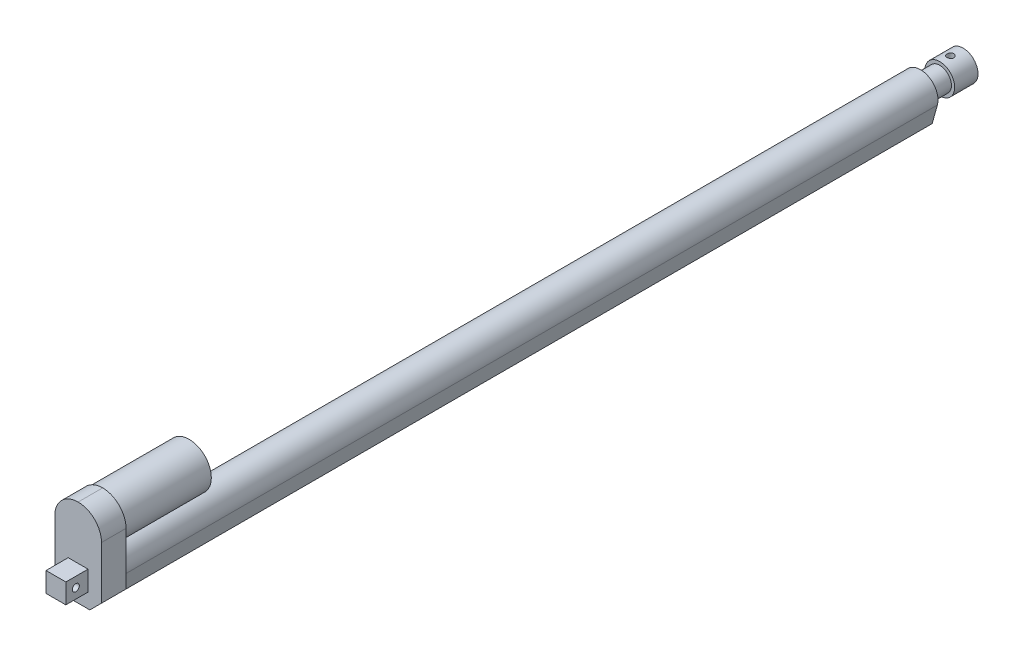
ISO-10303-21;
HEADER;
FILE_DESCRIPTION(('STEP AP214'),'2;1');
FILE_NAME('part.step','',(''),(''),'','','');
FILE_SCHEMA(('AUTOMOTIVE_DESIGN { 1 0 10303 214 1 1 1 1 }'));
ENDSEC;
DATA;
#1=APPLICATION_CONTEXT('core data for automotive mechanical design processes');
#2=APPLICATION_PROTOCOL_DEFINITION('international standard','automotive_design',2000,#1);
#3=PRODUCT_CONTEXT('',#1,'mechanical');
#4=PRODUCT('Part','Part','',(#3));
#5=PRODUCT_RELATED_PRODUCT_CATEGORY('part','',(#4));
#6=PRODUCT_DEFINITION_FORMATION('','',#4);
#7=PRODUCT_DEFINITION_CONTEXT('part definition',#1,'design');
#8=PRODUCT_DEFINITION('design','',#6,#7);
#9=PRODUCT_DEFINITION_SHAPE('','',#8);
#10=(LENGTH_UNIT() NAMED_UNIT(*) SI_UNIT(.MILLI.,.METRE.));
#11=(NAMED_UNIT(*) PLANE_ANGLE_UNIT() SI_UNIT($,.RADIAN.));
#12=(NAMED_UNIT(*) SI_UNIT($,.STERADIAN.) SOLID_ANGLE_UNIT());
#13=UNCERTAINTY_MEASURE_WITH_UNIT(LENGTH_MEASURE(1.E-05),#10,'distance_accuracy_value','');
#14=(GEOMETRIC_REPRESENTATION_CONTEXT(3) GLOBAL_UNCERTAINTY_ASSIGNED_CONTEXT((#13)) GLOBAL_UNIT_ASSIGNED_CONTEXT((#10,
#11,#12)) REPRESENTATION_CONTEXT('',''));
#15=CARTESIAN_POINT('',(0.,0.,0.));
#16=DIRECTION('',(0.,0.,1.));
#17=DIRECTION('',(1.,0.,0.));
#18=AXIS2_PLACEMENT_3D('',#15,#16,#17);
#19=CARTESIAN_POINT('',(0.,0.,0.));
#20=DIRECTION('',(0.,0.,1.));
#21=DIRECTION('',(1.,0.,0.));
#22=AXIS2_PLACEMENT_3D('',#19,#20,#21);
#23=PLANE('',#22);
#24=CARTESIAN_POINT('',(0.,17.5,0.));
#25=DIRECTION('',(0.,0.,1.));
#26=DIRECTION('',(1.,0.,0.));
#27=AXIS2_PLACEMENT_3D('',#24,#25,#26);
#28=CIRCLE('',#27,19.);
#29=CARTESIAN_POINT('',(19.,17.5,0.));
#30=VERTEX_POINT('',#29);
#31=EDGE_CURVE('E63',#30,#30,#28,.F.);
#32=ORIENTED_EDGE('',*,*,#31,.F.);
#33=EDGE_LOOP('',(#32));
#34=FACE_BOUND('',#33,.T.);
#35=DIRECTION('',(-0.26833752096446,0.96332495807108,0.));
#36=VECTOR('',#35,1.);
#37=CARTESIAN_POINT('',(-10.,-37.5,0.));
#38=LINE('',#37,#36);
#39=CARTESIAN_POINT('',(-10.,-37.5,0.));
#40=VERTEX_POINT('',#39);
#41=CARTESIAN_POINT('',(-14.4498743710662,-21.5250628144669,0.));
#42=VERTEX_POINT('',#41);
#43=EDGE_CURVE('E196',#40,#42,#38,.T.);
#44=ORIENTED_EDGE('',*,*,#43,.F.);
#45=DIRECTION('',(0.707106781186546,-0.707106781186549,0.));
#46=VECTOR('',#45,1.);
#47=CARTESIAN_POINT('',(-10.,-37.5,0.));
#48=LINE('',#47,#46);
#49=CARTESIAN_POINT('',(-20.,-27.5,0.));
#50=VERTEX_POINT('',#49);
#51=EDGE_CURVE('E285',#40,#50,#48,.F.);
#52=ORIENTED_EDGE('',*,*,#51,.T.);
#53=DIRECTION('',(0.,-1.,0.));
#54=VECTOR('',#53,1.);
#55=CARTESIAN_POINT('',(-20.,37.5,0.));
#56=LINE('',#55,#54);
#57=CARTESIAN_POINT('',(-20.,17.5,0.));
#58=VERTEX_POINT('',#57);
#59=EDGE_CURVE('E245',#58,#50,#56,.T.);
#60=ORIENTED_EDGE('',*,*,#59,.F.);
#61=CARTESIAN_POINT('',(0.,17.5,0.));
#62=DIRECTION('',(0.,0.,1.));
#63=DIRECTION('',(1.,0.,0.));
#64=AXIS2_PLACEMENT_3D('',#61,#62,#63);
#65=CIRCLE('',#64,20.);
#66=CARTESIAN_POINT('',(0.,37.5,0.));
#67=VERTEX_POINT('',#66);
#68=EDGE_CURVE('E258',#58,#67,#65,.F.);
#69=ORIENTED_EDGE('',*,*,#68,.T.);
#70=CARTESIAN_POINT('',(0.,17.5,0.));
#71=DIRECTION('',(0.,0.,1.));
#72=DIRECTION('',(1.,0.,0.));
#73=AXIS2_PLACEMENT_3D('',#70,#71,#72);
#74=CIRCLE('',#73,20.);
#75=CARTESIAN_POINT('',(20.,17.5,0.));
#76=VERTEX_POINT('',#75);
#77=EDGE_CURVE('E254',#67,#76,#74,.F.);
#78=ORIENTED_EDGE('',*,*,#77,.T.);
#79=DIRECTION('',(0.,1.,0.));
#80=VECTOR('',#79,1.);
#81=CARTESIAN_POINT('',(20.,37.5,0.));
#82=LINE('',#81,#80);
#83=CARTESIAN_POINT('',(20.,-27.5,0.));
#84=VERTEX_POINT('',#83);
#85=EDGE_CURVE('E237',#84,#76,#82,.T.);
#86=ORIENTED_EDGE('',*,*,#85,.F.);
#87=DIRECTION('',(0.707106781186548,0.707106781186547,0.));
#88=VECTOR('',#87,1.);
#89=CARTESIAN_POINT('',(20.,-27.5,0.));
#90=LINE('',#89,#88);
#91=CARTESIAN_POINT('',(9.99999999999996,-37.5,0.));
#92=VERTEX_POINT('',#91);
#93=EDGE_CURVE('E281',#84,#92,#90,.F.);
#94=ORIENTED_EDGE('',*,*,#93,.T.);
#95=DIRECTION('',(-0.268337520964462,-0.963324958071079,0.));
#96=VECTOR('',#95,1.);
#97=CARTESIAN_POINT('',(9.99999999999996,-37.5,0.));
#98=LINE('',#97,#96);
#99=CARTESIAN_POINT('',(14.4498743710662,-21.5250628144669,0.));
#100=VERTEX_POINT('',#99);
#101=EDGE_CURVE('E209',#100,#92,#98,.T.);
#102=ORIENTED_EDGE('',*,*,#101,.F.);
#103=CARTESIAN_POINT('',(0.,-17.5,0.));
#104=DIRECTION('',(0.,0.,-1.));
#105=DIRECTION('',(-1.,0.,0.));
#106=AXIS2_PLACEMENT_3D('',#103,#104,#105);
#107=CIRCLE('',#106,15.);
#108=EDGE_CURVE('E185',#42,#100,#107,.T.);
#109=ORIENTED_EDGE('',*,*,#108,.F.);
#110=EDGE_LOOP('',(#44,#52,#60,#69,#78,#86,#94,#102,#109));
#111=FACE_BOUND('',#110,.T.);
#112=ADVANCED_FACE('F47',(#34,#111),#23,.F.);
#113=CARTESIAN_POINT('',(-20.,37.5,21.));
#114=DIRECTION('',(1.,0.,0.));
#115=DIRECTION('',(0.,1.,0.));
#116=AXIS2_PLACEMENT_3D('',#113,#114,#115);
#117=PLANE('',#116);
#118=ORIENTED_EDGE('',*,*,#59,.T.);
#119=DIRECTION('',(0.,0.,1.));
#120=VECTOR('',#119,1.);
#121=CARTESIAN_POINT('',(-20.,-27.5,21.));
#122=LINE('',#121,#120);
#123=CARTESIAN_POINT('',(-20.,-27.5,21.));
#124=VERTEX_POINT('',#123);
#125=EDGE_CURVE('E288',#50,#124,#122,.T.);
#126=ORIENTED_EDGE('',*,*,#125,.T.);
#127=DIRECTION('',(0.,-1.,0.));
#128=VECTOR('',#127,1.);
#129=CARTESIAN_POINT('',(-20.,37.5,21.));
#130=LINE('',#129,#128);
#131=CARTESIAN_POINT('',(-20.,17.5,21.));
#132=VERTEX_POINT('',#131);
#133=EDGE_CURVE('E232',#132,#124,#130,.T.);
#134=ORIENTED_EDGE('',*,*,#133,.F.);
#135=DIRECTION('',(0.,0.,-1.));
#136=VECTOR('',#135,1.);
#137=CARTESIAN_POINT('',(-20.,17.5,21.));
#138=LINE('',#137,#136);
#139=EDGE_CURVE('E244',#132,#58,#138,.T.);
#140=ORIENTED_EDGE('',*,*,#139,.T.);
#141=EDGE_LOOP('',(#118,#126,#134,#140));
#142=FACE_BOUND('',#141,.T.);
#143=ADVANCED_FACE('F336',(#142),#117,.F.);
#144=CARTESIAN_POINT('',(-20.,-37.5,21.));
#145=DIRECTION('',(0.,1.,0.));
#146=DIRECTION('',(-1.,0.,0.));
#147=AXIS2_PLACEMENT_3D('',#144,#145,#146);
#148=PLANE('',#147);
#149=DIRECTION('',(1.,0.,0.));
#150=VECTOR('',#149,1.);
#151=CARTESIAN_POINT('',(-20.,-37.5,21.));
#152=LINE('',#151,#150);
#153=CARTESIAN_POINT('',(-10.,-37.5,21.));
#154=VERTEX_POINT('',#153);
#155=CARTESIAN_POINT('',(9.99999999999996,-37.5,21.));
#156=VERTEX_POINT('',#155);
#157=EDGE_CURVE('E236',#154,#156,#152,.T.);
#158=ORIENTED_EDGE('',*,*,#157,.F.);
#159=DIRECTION('',(0.,0.,-1.));
#160=VECTOR('',#159,1.);
#161=CARTESIAN_POINT('',(-10.,-37.5,21.));
#162=LINE('',#161,#160);
#163=EDGE_CURVE('E277',#154,#40,#162,.T.);
#164=ORIENTED_EDGE('',*,*,#163,.T.);
#165=DIRECTION('',(0.,0.,1.));
#166=VECTOR('',#165,1.);
#167=CARTESIAN_POINT('',(-10.,-37.5,-700.));
#168=LINE('',#167,#166);
#169=CARTESIAN_POINT('',(-10.,-37.5,-700.));
#170=VERTEX_POINT('',#169);
#171=EDGE_CURVE('E219',#170,#40,#168,.T.);
#172=ORIENTED_EDGE('',*,*,#171,.F.);
#173=DIRECTION('',(-1.,0.,0.));
#174=VECTOR('',#173,1.);
#175=CARTESIAN_POINT('',(9.99999999999996,-37.5,-700.));
#176=LINE('',#175,#174);
#177=CARTESIAN_POINT('',(9.99999999999996,-37.5,-700.));
#178=VERTEX_POINT('',#177);
#179=EDGE_CURVE('E199',#178,#170,#176,.T.);
#180=ORIENTED_EDGE('',*,*,#179,.F.);
#181=DIRECTION('',(0.,0.,1.));
#182=VECTOR('',#181,1.);
#183=CARTESIAN_POINT('',(9.99999999999996,-37.5,-700.));
#184=LINE('',#183,#182);
#185=EDGE_CURVE('E223',#178,#92,#184,.T.);
#186=ORIENTED_EDGE('',*,*,#185,.T.);
#187=DIRECTION('',(0.,0.,1.));
#188=VECTOR('',#187,1.);
#189=CARTESIAN_POINT('',(9.99999999999996,-37.5,21.));
#190=LINE('',#189,#188);
#191=EDGE_CURVE('E271',#92,#156,#190,.T.);
#192=ORIENTED_EDGE('',*,*,#191,.T.);
#193=EDGE_LOOP('',(#158,#164,#172,#180,#186,#192));
#194=FACE_BOUND('',#193,.T.);
#195=ADVANCED_FACE('F344',(#194),#148,.F.);
#196=CARTESIAN_POINT('',(20.,37.5,21.));
#197=DIRECTION('',(-1.,0.,0.));
#198=DIRECTION('',(0.,-1.,0.));
#199=AXIS2_PLACEMENT_3D('',#196,#197,#198);
#200=PLANE('',#199);
#201=DIRECTION('',(0.,1.,0.));
#202=VECTOR('',#201,1.);
#203=CARTESIAN_POINT('',(20.,37.5,21.));
#204=LINE('',#203,#202);
#205=CARTESIAN_POINT('',(20.,-27.5,21.));
#206=VERTEX_POINT('',#205);
#207=CARTESIAN_POINT('',(20.,17.5,21.));
#208=VERTEX_POINT('',#207);
#209=EDGE_CURVE('E241',#206,#208,#204,.T.);
#210=ORIENTED_EDGE('',*,*,#209,.F.);
#211=DIRECTION('',(0.,0.,-1.));
#212=VECTOR('',#211,1.);
#213=CARTESIAN_POINT('',(20.,-27.5,21.));
#214=LINE('',#213,#212);
#215=EDGE_CURVE('E297',#206,#84,#214,.T.);
#216=ORIENTED_EDGE('',*,*,#215,.T.);
#217=ORIENTED_EDGE('',*,*,#85,.T.);
#218=DIRECTION('',(0.,0.,-1.));
#219=VECTOR('',#218,1.);
#220=CARTESIAN_POINT('',(20.,17.5,21.));
#221=LINE('',#220,#219);
#222=EDGE_CURVE('E267',#76,#208,#221,.F.);
#223=ORIENTED_EDGE('',*,*,#222,.T.);
#224=EDGE_LOOP('',(#210,#216,#217,#223));
#225=FACE_BOUND('',#224,.T.);
#226=ADVANCED_FACE('F353',(#225),#200,.F.);
#227=CARTESIAN_POINT('',(0.,0.,21.));
#228=DIRECTION('',(0.,0.,1.));
#229=DIRECTION('',(1.,0.,0.));
#230=AXIS2_PLACEMENT_3D('',#227,#228,#229);
#231=PLANE('',#230);
#232=DIRECTION('',(0.,-1.,0.));
#233=VECTOR('',#232,1.);
#234=CARTESIAN_POINT('',(-8.5,-8.,21.));
#235=LINE('',#234,#233);
#236=CARTESIAN_POINT('',(-8.5,-8.,21.));
#237=VERTEX_POINT('',#236);
#238=CARTESIAN_POINT('',(-8.5,-25.,21.));
#239=VERTEX_POINT('',#238);
#240=EDGE_CURVE('E71',#237,#239,#235,.T.);
#241=ORIENTED_EDGE('',*,*,#240,.F.);
#242=DIRECTION('',(-1.,0.,0.));
#243=VECTOR('',#242,1.);
#244=CARTESIAN_POINT('',(-8.5,-8.,21.));
#245=LINE('',#244,#243);
#246=CARTESIAN_POINT('',(8.5,-8.,21.));
#247=VERTEX_POINT('',#246);
#248=EDGE_CURVE('E75',#247,#237,#245,.T.);
#249=ORIENTED_EDGE('',*,*,#248,.F.);
#250=DIRECTION('',(0.,1.,0.));
#251=VECTOR('',#250,1.);
#252=CARTESIAN_POINT('',(8.5,-8.,21.));
#253=LINE('',#252,#251);
#254=CARTESIAN_POINT('',(8.5,-25.,21.));
#255=VERTEX_POINT('',#254);
#256=EDGE_CURVE('E574',#255,#247,#253,.T.);
#257=ORIENTED_EDGE('',*,*,#256,.F.);
#258=DIRECTION('',(1.,0.,0.));
#259=VECTOR('',#258,1.);
#260=CARTESIAN_POINT('',(-8.5,-25.,21.));
#261=LINE('',#260,#259);
#262=EDGE_CURVE('E571',#239,#255,#261,.T.);
#263=ORIENTED_EDGE('',*,*,#262,.F.);
#264=EDGE_LOOP('',(#241,#249,#257,#263));
#265=FACE_BOUND('',#264,.T.);
#266=ORIENTED_EDGE('',*,*,#133,.T.);
#267=DIRECTION('',(-0.707106781186546,0.707106781186549,0.));
#268=VECTOR('',#267,1.);
#269=CARTESIAN_POINT('',(-23.75,-23.7499999999999,21.));
#270=LINE('',#269,#268);
#271=EDGE_CURVE('E294',#124,#154,#270,.F.);
#272=ORIENTED_EDGE('',*,*,#271,.T.);
#273=ORIENTED_EDGE('',*,*,#157,.T.);
#274=DIRECTION('',(-0.707106781186548,-0.707106781186547,0.));
#275=VECTOR('',#274,1.);
#276=CARTESIAN_POINT('',(23.75,-23.75,21.));
#277=LINE('',#276,#275);
#278=EDGE_CURVE('E291',#156,#206,#277,.F.);
#279=ORIENTED_EDGE('',*,*,#278,.T.);
#280=ORIENTED_EDGE('',*,*,#209,.T.);
#281=CARTESIAN_POINT('',(0.,17.5,21.));
#282=DIRECTION('',(0.,0.,1.));
#283=DIRECTION('',(1.,0.,0.));
#284=AXIS2_PLACEMENT_3D('',#281,#282,#283);
#285=CIRCLE('',#284,20.);
#286=CARTESIAN_POINT('',(0.,37.5,21.));
#287=VERTEX_POINT('',#286);
#288=EDGE_CURVE('E261',#208,#287,#285,.T.);
#289=ORIENTED_EDGE('',*,*,#288,.T.);
#290=CARTESIAN_POINT('',(0.,17.5,21.));
#291=DIRECTION('',(0.,0.,1.));
#292=DIRECTION('',(1.,0.,0.));
#293=AXIS2_PLACEMENT_3D('',#290,#291,#292);
#294=CIRCLE('',#293,20.);
#295=EDGE_CURVE('E264',#287,#132,#294,.T.);
#296=ORIENTED_EDGE('',*,*,#295,.T.);
#297=EDGE_LOOP('',(#266,#272,#273,#279,#280,#289,#296));
#298=FACE_BOUND('',#297,.T.);
#299=ADVANCED_FACE('F351',(#265,#298),#231,.T.);
#300=CARTESIAN_POINT('',(0.,17.5,21.));
#301=DIRECTION('',(0.,0.,-1.));
#302=DIRECTION('',(-1.,0.,0.));
#303=AXIS2_PLACEMENT_3D('',#300,#301,#302);
#304=CYLINDRICAL_SURFACE('',#303,20.);
#305=DIRECTION('',(0.,0.,-1.));
#306=VECTOR('',#305,1.);
#307=CARTESIAN_POINT('',(0.,37.5,21.));
#308=LINE('',#307,#306);
#309=EDGE_CURVE('E231',#287,#67,#308,.T.);
#310=ORIENTED_EDGE('',*,*,#309,.F.);
#311=ORIENTED_EDGE('',*,*,#288,.F.);
#312=ORIENTED_EDGE('',*,*,#222,.F.);
#313=ORIENTED_EDGE('',*,*,#77,.F.);
#314=EDGE_LOOP('',(#310,#311,#312,#313));
#315=FACE_BOUND('',#314,.T.);
#316=ADVANCED_FACE('F364',(#315),#304,.T.);
#317=CARTESIAN_POINT('',(0.,17.5,21.));
#318=DIRECTION('',(0.,0.,-1.));
#319=DIRECTION('',(-1.,0.,0.));
#320=AXIS2_PLACEMENT_3D('',#317,#318,#319);
#321=CYLINDRICAL_SURFACE('',#320,20.);
#322=ORIENTED_EDGE('',*,*,#295,.F.);
#323=ORIENTED_EDGE('',*,*,#309,.T.);
#324=ORIENTED_EDGE('',*,*,#68,.F.);
#325=ORIENTED_EDGE('',*,*,#139,.F.);
#326=EDGE_LOOP('',(#322,#323,#324,#325));
#327=FACE_BOUND('',#326,.T.);
#328=ADVANCED_FACE('F360',(#327),#321,.T.);
#329=CARTESIAN_POINT('',(-10.,-37.5,21.));
#330=DIRECTION('',(0.707106781186549,0.707106781186546,0.));
#331=DIRECTION('',(0.,0.,-1.));
#332=AXIS2_PLACEMENT_3D('',#329,#330,#331);
#333=PLANE('',#332);
#334=ORIENTED_EDGE('',*,*,#271,.F.);
#335=ORIENTED_EDGE('',*,*,#125,.F.);
#336=ORIENTED_EDGE('',*,*,#51,.F.);
#337=ORIENTED_EDGE('',*,*,#163,.F.);
#338=EDGE_LOOP('',(#334,#335,#336,#337));
#339=FACE_BOUND('',#338,.T.);
#340=ADVANCED_FACE('F363',(#339),#333,.F.);
#341=CARTESIAN_POINT('',(20.,-27.5,21.));
#342=DIRECTION('',(-0.707106781186547,0.707106781186548,0.));
#343=DIRECTION('',(0.,0.,-1.));
#344=AXIS2_PLACEMENT_3D('',#341,#342,#343);
#345=PLANE('',#344);
#346=ORIENTED_EDGE('',*,*,#278,.F.);
#347=ORIENTED_EDGE('',*,*,#191,.F.);
#348=ORIENTED_EDGE('',*,*,#93,.F.);
#349=ORIENTED_EDGE('',*,*,#215,.F.);
#350=EDGE_LOOP('',(#346,#347,#348,#349));
#351=FACE_BOUND('',#350,.T.);
#352=ADVANCED_FACE('F50',(#351),#345,.F.);
#353=CARTESIAN_POINT('',(0.,-17.5,-700.));
#354=DIRECTION('',(0.,0.,1.));
#355=DIRECTION('',(1.,0.,0.));
#356=AXIS2_PLACEMENT_3D('',#353,#354,#355);
#357=CYLINDRICAL_SURFACE('',#356,15.);
#358=ORIENTED_EDGE('',*,*,#108,.T.);
#359=DIRECTION('',(0.,0.,1.));
#360=VECTOR('',#359,1.);
#361=CARTESIAN_POINT('',(14.4498743710662,-21.5250628144669,-700.));
#362=LINE('',#361,#360);
#363=CARTESIAN_POINT('',(14.4498743710662,-21.5250628144669,-700.));
#364=VERTEX_POINT('',#363);
#365=EDGE_CURVE('E227',#364,#100,#362,.T.);
#366=ORIENTED_EDGE('',*,*,#365,.F.);
#367=CARTESIAN_POINT('',(0.,-17.5,-700.));
#368=DIRECTION('',(0.,0.,-1.));
#369=DIRECTION('',(-1.,0.,0.));
#370=AXIS2_PLACEMENT_3D('',#367,#368,#369);
#371=CIRCLE('',#370,15.);
#372=CARTESIAN_POINT('',(-14.4498743710662,-21.5250628144669,-700.));
#373=VERTEX_POINT('',#372);
#374=EDGE_CURVE('E191',#373,#364,#371,.T.);
#375=ORIENTED_EDGE('',*,*,#374,.F.);
#376=DIRECTION('',(0.,0.,1.));
#377=VECTOR('',#376,1.);
#378=CARTESIAN_POINT('',(-14.4498743710662,-21.5250628144669,-700.));
#379=LINE('',#378,#377);
#380=EDGE_CURVE('E205',#373,#42,#379,.T.);
#381=ORIENTED_EDGE('',*,*,#380,.T.);
#382=EDGE_LOOP('',(#358,#366,#375,#381));
#383=FACE_BOUND('',#382,.T.);
#384=ADVANCED_FACE('F377',(#383),#357,.T.);
#385=CARTESIAN_POINT('',(9.99999999999996,-37.5,-700.));
#386=DIRECTION('',(-0.963324958071079,0.268337520964462,0.));
#387=DIRECTION('',(-0.268337520964462,-0.963324958071079,0.));
#388=AXIS2_PLACEMENT_3D('',#385,#386,#387);
#389=PLANE('',#388);
#390=ORIENTED_EDGE('',*,*,#101,.T.);
#391=ORIENTED_EDGE('',*,*,#185,.F.);
#392=DIRECTION('',(-0.268337520964462,-0.963324958071079,0.));
#393=VECTOR('',#392,1.);
#394=CARTESIAN_POINT('',(9.99999999999996,-37.5,-700.));
#395=LINE('',#394,#393);
#396=EDGE_CURVE('E195',#364,#178,#395,.T.);
#397=ORIENTED_EDGE('',*,*,#396,.F.);
#398=ORIENTED_EDGE('',*,*,#365,.T.);
#399=EDGE_LOOP('',(#390,#391,#397,#398));
#400=FACE_BOUND('',#399,.T.);
#401=ADVANCED_FACE('F393',(#400),#389,.F.);
#402=CARTESIAN_POINT('',(-10.,-37.5,-700.));
#403=DIRECTION('',(0.96332495807108,0.26833752096446,0.));
#404=DIRECTION('',(-0.26833752096446,0.96332495807108,0.));
#405=AXIS2_PLACEMENT_3D('',#402,#403,#404);
#406=PLANE('',#405);
#407=ORIENTED_EDGE('',*,*,#43,.T.);
#408=ORIENTED_EDGE('',*,*,#380,.F.);
#409=DIRECTION('',(-0.26833752096446,0.96332495807108,0.));
#410=VECTOR('',#409,1.);
#411=CARTESIAN_POINT('',(-10.,-37.5,-700.));
#412=LINE('',#411,#410);
#413=EDGE_CURVE('E202',#170,#373,#412,.T.);
#414=ORIENTED_EDGE('',*,*,#413,.F.);
#415=ORIENTED_EDGE('',*,*,#171,.T.);
#416=EDGE_LOOP('',(#407,#408,#414,#415));
#417=FACE_BOUND('',#416,.T.);
#418=ADVANCED_FACE('F399',(#417),#406,.F.);
#419=CARTESIAN_POINT('',(0.,-17.5,-700.));
#420=DIRECTION('',(0.,0.,-1.));
#421=DIRECTION('',(-1.,0.,0.));
#422=AXIS2_PLACEMENT_3D('',#419,#420,#421);
#423=PLANE('',#422);
#424=CARTESIAN_POINT('',(0.,-17.5,-700.));
#425=DIRECTION('',(0.,0.,-1.));
#426=DIRECTION('',(-1.,0.,0.));
#427=AXIS2_PLACEMENT_3D('',#424,#425,#426);
#428=CIRCLE('',#427,10.);
#429=CARTESIAN_POINT('',(-10.,-17.5,-700.));
#430=VERTEX_POINT('',#429);
#431=EDGE_CURVE('E11',#430,#430,#428,.T.);
#432=ORIENTED_EDGE('',*,*,#431,.F.);
#433=EDGE_LOOP('',(#432));
#434=FACE_BOUND('',#433,.T.);
#435=ORIENTED_EDGE('',*,*,#374,.T.);
#436=ORIENTED_EDGE('',*,*,#396,.T.);
#437=ORIENTED_EDGE('',*,*,#179,.T.);
#438=ORIENTED_EDGE('',*,*,#413,.T.);
#439=EDGE_LOOP('',(#435,#436,#437,#438));
#440=FACE_BOUND('',#439,.T.);
#441=ADVANCED_FACE('F402',(#434,#440),#423,.T.);
#442=CARTESIAN_POINT('',(0.,17.5,-74.));
#443=DIRECTION('',(0.,0.,1.));
#444=DIRECTION('',(1.,0.,0.));
#445=AXIS2_PLACEMENT_3D('',#442,#443,#444);
#446=CYLINDRICAL_SURFACE('',#445,19.);
#447=CARTESIAN_POINT('',(0.,17.5,-74.));
#448=DIRECTION('',(0.,0.,-1.));
#449=DIRECTION('',(-1.,0.,0.));
#450=AXIS2_PLACEMENT_3D('',#447,#448,#449);
#451=CIRCLE('',#450,19.);
#452=CARTESIAN_POINT('',(-19.,17.5,-74.));
#453=VERTEX_POINT('',#452);
#454=EDGE_CURVE('E180',#453,#453,#451,.T.);
#455=ORIENTED_EDGE('',*,*,#454,.F.);
#456=EDGE_LOOP('',(#455));
#457=FACE_BOUND('',#456,.T.);
#458=ORIENTED_EDGE('',*,*,#31,.T.);
#459=EDGE_LOOP('',(#458));
#460=FACE_BOUND('',#459,.T.);
#461=ADVANCED_FACE('F404',(#457,#460),#446,.T.);
#462=CARTESIAN_POINT('',(0.,17.5,-74.));
#463=DIRECTION('',(0.,0.,-1.));
#464=DIRECTION('',(-1.,0.,0.));
#465=AXIS2_PLACEMENT_3D('',#462,#463,#464);
#466=PLANE('',#465);
#467=ORIENTED_EDGE('',*,*,#454,.T.);
#468=EDGE_LOOP('',(#467));
#469=FACE_BOUND('',#468,.T.);
#470=ADVANCED_FACE('F411',(#469),#466,.T.);
#471=CARTESIAN_POINT('',(-8.5,-8.,40.));
#472=DIRECTION('',(1.,0.,0.));
#473=DIRECTION('',(0.,1.,0.));
#474=AXIS2_PLACEMENT_3D('',#471,#472,#473);
#475=PLANE('',#474);
#476=CARTESIAN_POINT('',(-8.5,-16.5,31.5));
#477=DIRECTION('',(-1.,0.,0.));
#478=DIRECTION('',(0.,-1.,0.));
#479=AXIS2_PLACEMENT_3D('',#476,#477,#478);
#480=CIRCLE('',#479,3.);
#481=CARTESIAN_POINT('',(-8.5,-19.5,31.5));
#482=VERTEX_POINT('',#481);
#483=EDGE_CURVE('E307',#482,#482,#480,.T.);
#484=ORIENTED_EDGE('',*,*,#483,.F.);
#485=EDGE_LOOP('',(#484));
#486=FACE_BOUND('',#485,.T.);
#487=ORIENTED_EDGE('',*,*,#240,.T.);
#488=DIRECTION('',(0.,0.,-1.));
#489=VECTOR('',#488,1.);
#490=CARTESIAN_POINT('',(-8.5,-25.,40.));
#491=LINE('',#490,#489);
#492=CARTESIAN_POINT('',(-8.5,-25.,40.));
#493=VERTEX_POINT('',#492);
#494=EDGE_CURVE('E160',#493,#239,#491,.T.);
#495=ORIENTED_EDGE('',*,*,#494,.F.);
#496=DIRECTION('',(0.,-1.,0.));
#497=VECTOR('',#496,1.);
#498=CARTESIAN_POINT('',(-8.5,-8.,40.));
#499=LINE('',#498,#497);
#500=CARTESIAN_POINT('',(-8.5,-8.,40.));
#501=VERTEX_POINT('',#500);
#502=EDGE_CURVE('E167',#501,#493,#499,.T.);
#503=ORIENTED_EDGE('',*,*,#502,.F.);
#504=DIRECTION('',(0.,0.,-1.));
#505=VECTOR('',#504,1.);
#506=CARTESIAN_POINT('',(-8.5,-8.,40.));
#507=LINE('',#506,#505);
#508=EDGE_CURVE('E568',#501,#237,#507,.T.);
#509=ORIENTED_EDGE('',*,*,#508,.T.);
#510=EDGE_LOOP('',(#487,#495,#503,#509));
#511=FACE_BOUND('',#510,.T.);
#512=ADVANCED_FACE('F178',(#486,#511),#475,.F.);
#513=CARTESIAN_POINT('',(-8.5,-25.,40.));
#514=DIRECTION('',(0.,1.,0.));
#515=DIRECTION('',(0.,0.,1.));
#516=AXIS2_PLACEMENT_3D('',#513,#514,#515);
#517=PLANE('',#516);
#518=ORIENTED_EDGE('',*,*,#262,.T.);
#519=DIRECTION('',(0.,0.,-1.));
#520=VECTOR('',#519,1.);
#521=CARTESIAN_POINT('',(8.5,-25.,40.));
#522=LINE('',#521,#520);
#523=CARTESIAN_POINT('',(8.5,-25.,40.));
#524=VERTEX_POINT('',#523);
#525=EDGE_CURVE('E162',#524,#255,#522,.T.);
#526=ORIENTED_EDGE('',*,*,#525,.F.);
#527=DIRECTION('',(1.,0.,0.));
#528=VECTOR('',#527,1.);
#529=CARTESIAN_POINT('',(-8.5,-25.,40.));
#530=LINE('',#529,#528);
#531=EDGE_CURVE('E155',#493,#524,#530,.T.);
#532=ORIENTED_EDGE('',*,*,#531,.F.);
#533=ORIENTED_EDGE('',*,*,#494,.T.);
#534=EDGE_LOOP('',(#518,#526,#532,#533));
#535=FACE_BOUND('',#534,.T.);
#536=ADVANCED_FACE('F158',(#535),#517,.F.);
#537=CARTESIAN_POINT('',(8.5,-8.,40.));
#538=DIRECTION('',(-1.,0.,0.));
#539=DIRECTION('',(0.,0.,1.));
#540=AXIS2_PLACEMENT_3D('',#537,#538,#539);
#541=PLANE('',#540);
#542=CARTESIAN_POINT('',(8.5,-16.5,31.5));
#543=DIRECTION('',(-1.,0.,0.));
#544=DIRECTION('',(0.,0.,1.));
#545=AXIS2_PLACEMENT_3D('',#542,#543,#544);
#546=CIRCLE('',#545,3.);
#547=CARTESIAN_POINT('',(8.5,-16.5,34.5));
#548=VERTEX_POINT('',#547);
#549=EDGE_CURVE('E304',#548,#548,#546,.T.);
#550=ORIENTED_EDGE('',*,*,#549,.T.);
#551=EDGE_LOOP('',(#550));
#552=FACE_BOUND('',#551,.T.);
#553=ORIENTED_EDGE('',*,*,#256,.T.);
#554=DIRECTION('',(0.,0.,-1.));
#555=VECTOR('',#554,1.);
#556=CARTESIAN_POINT('',(8.5,-8.,40.));
#557=LINE('',#556,#555);
#558=CARTESIAN_POINT('',(8.5,-8.,40.));
#559=VERTEX_POINT('',#558);
#560=EDGE_CURVE('E187',#559,#247,#557,.T.);
#561=ORIENTED_EDGE('',*,*,#560,.F.);
#562=DIRECTION('',(0.,1.,0.));
#563=VECTOR('',#562,1.);
#564=CARTESIAN_POINT('',(8.5,-8.,40.));
#565=LINE('',#564,#563);
#566=EDGE_CURVE('E166',#524,#559,#565,.T.);
#567=ORIENTED_EDGE('',*,*,#566,.F.);
#568=ORIENTED_EDGE('',*,*,#525,.T.);
#569=EDGE_LOOP('',(#553,#561,#567,#568));
#570=FACE_BOUND('',#569,.T.);
#571=ADVANCED_FACE('F472',(#552,#570),#541,.F.);
#572=CARTESIAN_POINT('',(-8.5,-8.,40.));
#573=DIRECTION('',(0.,-1.,0.));
#574=DIRECTION('',(0.,0.,-1.));
#575=AXIS2_PLACEMENT_3D('',#572,#573,#574);
#576=PLANE('',#575);
#577=ORIENTED_EDGE('',*,*,#248,.T.);
#578=ORIENTED_EDGE('',*,*,#508,.F.);
#579=DIRECTION('',(-1.,0.,0.));
#580=VECTOR('',#579,1.);
#581=CARTESIAN_POINT('',(-8.5,-8.,40.));
#582=LINE('',#581,#580);
#583=EDGE_CURVE('E172',#559,#501,#582,.T.);
#584=ORIENTED_EDGE('',*,*,#583,.F.);
#585=ORIENTED_EDGE('',*,*,#560,.T.);
#586=EDGE_LOOP('',(#577,#578,#584,#585));
#587=FACE_BOUND('',#586,.T.);
#588=ADVANCED_FACE('F481',(#587),#576,.F.);
#589=CARTESIAN_POINT('',(0.,0.,40.));
#590=DIRECTION('',(0.,0.,1.));
#591=DIRECTION('',(1.,0.,0.));
#592=AXIS2_PLACEMENT_3D('',#589,#590,#591);
#593=PLANE('',#592);
#594=ORIENTED_EDGE('',*,*,#502,.T.);
#595=ORIENTED_EDGE('',*,*,#531,.T.);
#596=ORIENTED_EDGE('',*,*,#566,.T.);
#597=ORIENTED_EDGE('',*,*,#583,.T.);
#598=EDGE_LOOP('',(#594,#595,#596,#597));
#599=FACE_BOUND('',#598,.T.);
#600=ADVANCED_FACE('F170',(#599),#593,.T.);
#601=CARTESIAN_POINT('',(10.5,-16.5,31.5));
#602=DIRECTION('',(-1.,0.,0.));
#603=DIRECTION('',(0.,-1.,0.));
#604=AXIS2_PLACEMENT_3D('',#601,#602,#603);
#605=CYLINDRICAL_SURFACE('',#604,3.);
#606=ORIENTED_EDGE('',*,*,#483,.T.);
#607=EDGE_LOOP('',(#606));
#608=FACE_BOUND('',#607,.T.);
#609=ORIENTED_EDGE('',*,*,#549,.F.);
#610=EDGE_LOOP('',(#609));
#611=FACE_BOUND('',#610,.T.);
#612=ADVANCED_FACE('F498',(#608,#611),#605,.F.);
#613=CARTESIAN_POINT('',(0.,-17.5,-716.5));
#614=DIRECTION('',(0.,0.,1.));
#615=DIRECTION('',(1.,0.,0.));
#616=AXIS2_PLACEMENT_3D('',#613,#614,#615);
#617=CYLINDRICAL_SURFACE('',#616,10.);
#618=CARTESIAN_POINT('',(0.,-17.5,-716.5));
#619=DIRECTION('',(0.,0.,-1.));
#620=DIRECTION('',(-1.,0.,0.));
#621=AXIS2_PLACEMENT_3D('',#618,#619,#620);
#622=CIRCLE('',#621,10.);
#623=CARTESIAN_POINT('',(-10.,-17.5,-716.5));
#624=VERTEX_POINT('',#623);
#625=EDGE_CURVE('E556',#624,#624,#622,.T.);
#626=ORIENTED_EDGE('',*,*,#625,.F.);
#627=EDGE_LOOP('',(#626));
#628=FACE_BOUND('',#627,.T.);
#629=ORIENTED_EDGE('',*,*,#431,.T.);
#630=EDGE_LOOP('',(#629));
#631=FACE_BOUND('',#630,.T.);
#632=ADVANCED_FACE('F506',(#628,#631),#617,.T.);
#633=CARTESIAN_POINT('',(0.,-17.5,-736.5));
#634=DIRECTION('',(0.,0.,1.));
#635=DIRECTION('',(1.,0.,0.));
#636=AXIS2_PLACEMENT_3D('',#633,#634,#635);
#637=CYLINDRICAL_SURFACE('',#636,12.75);
#638=CARTESIAN_POINT('',(2.89999999999995,-5.08418347429376,-725.5));
#639=CARTESIAN_POINT('',(2.8999947066706,-5.08418024009124,-725.339382813536));
#640=CARTESIAN_POINT('',(2.88661086198179,-5.08103276577209,-725.178703423536));
#641=CARTESIAN_POINT('',(2.83349473719689,-5.06880844404634,-724.861925962473));
#642=CARTESIAN_POINT('',(2.79374440616783,-5.05972753457547,-724.705831106564));
#643=CARTESIAN_POINT('',(2.68922152267629,-5.03671680217567,-724.402850659619));
#644=CARTESIAN_POINT('',(2.62447770646339,-5.02279254969122,-724.255954716744));
#645=CARTESIAN_POINT('',(2.47188946827227,-4.99167080159537,-723.975102954452));
#646=CARTESIAN_POINT('',(2.38404512715326,-4.97447331744138,-723.841147089742));
#647=CARTESIAN_POINT('',(2.18603953500256,-4.93839197215515,-723.58753201007));
#648=CARTESIAN_POINT('',(2.07553571492542,-4.91948506842421,-723.468143479688));
#649=CARTESIAN_POINT('',(1.83608707574349,-4.8823164414492,-723.249426469049));
#650=CARTESIAN_POINT('',(1.70714075102396,-4.86405477103281,-723.150099628192));
#651=CARTESIAN_POINT('',(1.43264190134865,-4.82998216351697,-722.973244941256));
#652=CARTESIAN_POINT('',(1.28691657916219,-4.8142015893549,-722.895978942702));
#653=CARTESIAN_POINT('',(0.984130083380713,-4.78713019613936,-722.767135536821));
#654=CARTESIAN_POINT('',(0.82707029004177,-4.77583883149845,-722.715555007667));
#655=CARTESIAN_POINT('',(0.508889873660179,-4.75918093827664,-722.640402273894));
#656=CARTESIAN_POINT('',(0.347882719724966,-4.75371751481019,-722.616371507494));
#657=CARTESIAN_POINT('',(0.0240357823438298,-4.74899485235729,-722.595565204198));
#658=CARTESIAN_POINT('',(-0.138803772638727,-4.74973484830444,-722.598786306335));
#659=CARTESIAN_POINT('',(-0.458526821483385,-4.75726210613987,-722.632053892257));
#660=CARTESIAN_POINT('',(-0.615464776207775,-4.76393789934118,-722.661605927089));
#661=CARTESIAN_POINT('',(-0.922093595771191,-4.78245893220392,-722.745906768217));
#662=CARTESIAN_POINT('',(-1.07178411562345,-4.79430441768078,-722.800656772665));
#663=CARTESIAN_POINT('',(-1.36102278585826,-4.82201081846729,-722.934226689097));
#664=CARTESIAN_POINT('',(-1.50048275636981,-4.83790232185055,-723.013230945069));
#665=CARTESIAN_POINT('',(-1.76434410092863,-4.87196312720296,-723.19292867438));
#666=CARTESIAN_POINT('',(-1.88874326480525,-4.89013276269309,-723.293625325063));
#667=CARTESIAN_POINT('',(-2.12189507498416,-4.92723854134617,-723.516530668916));
#668=CARTESIAN_POINT('',(-2.23023319337752,-4.94618273373726,-723.639172008952));
#669=CARTESIAN_POINT('',(-2.4248864580819,-4.98232227607026,-723.90107929633));
#670=CARTESIAN_POINT('',(-2.5112009048479,-4.99951757045094,-724.040345771535));
#671=CARTESIAN_POINT('',(-2.65956198329806,-5.03023590666105,-724.332257907726));
#672=CARTESIAN_POINT('',(-2.72152462525733,-5.04374619066815,-724.484947688727));
#673=CARTESIAN_POINT('',(-2.81878284429367,-5.0653921688415,-724.798954077907));
#674=CARTESIAN_POINT('',(-2.85408303531641,-5.0735287928907,-724.960269188295));
#675=CARTESIAN_POINT('',(-2.89635953600838,-5.08331500139374,-725.283144240712));
#676=CARTESIAN_POINT('',(-2.90394190753984,-5.08510336757563,-725.444620713962));
#677=CARTESIAN_POINT('',(-2.8922132964472,-5.08236585420117,-725.766530539491));
#678=CARTESIAN_POINT('',(-2.8729043247601,-5.07784044678932,-725.926963968867));
#679=CARTESIAN_POINT('',(-2.80846852886202,-5.06311686803961,-726.240086450784));
#680=CARTESIAN_POINT('',(-2.76368052994885,-5.05299319202625,-726.392849057469));
#681=CARTESIAN_POINT('',(-2.64992722756633,-5.02828189927459,-726.688701097856));
#682=CARTESIAN_POINT('',(-2.58095945735488,-5.01369382711234,-726.831789542853));
#683=CARTESIAN_POINT('',(-2.41948703227168,-4.98139593718805,-727.106839691637));
#684=CARTESIAN_POINT('',(-2.32661195598432,-4.96363847800599,-727.238578222423));
#685=CARTESIAN_POINT('',(-2.12044158335228,-4.92712587414477,-727.484822752496));
#686=CARTESIAN_POINT('',(-2.00714353414724,-4.90837059520766,-727.599326424833));
#687=CARTESIAN_POINT('',(-1.76059026579311,-4.87151467345508,-727.810230516097));
#688=CARTESIAN_POINT('',(-1.62697649639737,-4.85343505863958,-727.90621609212));
#689=CARTESIAN_POINT('',(-1.34517042359882,-4.82036619982967,-728.074380527408));
#690=CARTESIAN_POINT('',(-1.19697882893036,-4.80537680570669,-728.146560543293));
#691=CARTESIAN_POINT('',(-0.891182122387237,-4.78026533882733,-728.264500823917));
#692=CARTESIAN_POINT('',(-0.733647127266444,-4.77011116674637,-728.310435739783));
#693=CARTESIAN_POINT('',(-0.41283751848966,-4.75567495004301,-728.375122540636));
#694=CARTESIAN_POINT('',(-0.249563815200829,-4.75139197830908,-728.3938787174));
#695=CARTESIAN_POINT('',(0.0741616661742186,-4.74921102635857,-728.403469587805));
#696=CARTESIAN_POINT('',(0.234594509071124,-4.75117186575498,-728.3949216479));
#697=CARTESIAN_POINT('',(0.551673153314573,-4.76095291554794,-728.351536666848));
#698=CARTESIAN_POINT('',(0.708319033732357,-4.76877300349496,-728.316700175093));
#699=CARTESIAN_POINT('',(1.0128542818967,-4.7893803147506,-728.222032778667));
#700=CARTESIAN_POINT('',(1.16077423785793,-4.80214883173757,-728.162295940136));
#701=CARTESIAN_POINT('',(1.44457042379392,-4.83129485476776,-728.019612896915));
#702=CARTESIAN_POINT('',(1.58044538275682,-4.84767274104461,-727.936664246699));
#703=CARTESIAN_POINT('',(1.83928441571629,-4.88267241591208,-727.747933762338));
#704=CARTESIAN_POINT('',(1.9619295669868,-4.90133307839274,-727.641721711021));
#705=CARTESIAN_POINT('',(2.18786639394153,-4.93859550878699,-727.410338688884));
#706=CARTESIAN_POINT('',(2.29115334380485,-4.95719726123236,-727.285163102041));
#707=CARTESIAN_POINT('',(2.47691519161857,-4.99254275843722,-727.017188811538));
#708=CARTESIAN_POINT('',(2.55906130264087,-5.00925511733263,-726.874157787199));
#709=CARTESIAN_POINT('',(2.69801887899904,-5.03852839000754,-726.575966296075));
#710=CARTESIAN_POINT('',(2.75485100383623,-5.05109268696895,-726.420815842329));
#711=CARTESIAN_POINT('',(2.83186251953856,-5.06841815455046,-726.138010811904));
#712=CARTESIAN_POINT('',(2.8573633630134,-5.07428956551272,-726.011846461577));
#713=CARTESIAN_POINT('',(2.89143373882075,-5.08217340985418,-725.75713460592));
#714=CARTESIAN_POINT('',(2.90000423774442,-5.08418606353825,-725.628587237067));
#715=CARTESIAN_POINT('',(2.89999999999995,-5.08418347429376,-725.5));
#716=B_SPLINE_CURVE_WITH_KNOTS('',3,(#638,#639,#640,#641,#642,#643,#644,#645,#646,#647,#648,
#649,#650,#651,#652,#653,#654,#655,#656,#657,#658,#659,#660,#661,#662,#663,#664,#665,#666,#667,
#668,#669,#670,#671,#672,#673,#674,#675,#676,#677,#678,#679,#680,#681,#682,#683,#684,#685,#686,
#687,#688,#689,#690,#691,#692,#693,#694,#695,#696,#697,#698,#699,#700,#701,#702,#703,#704,#705,
#706,#707,#708,#709,#710,#711,#712,#713,#714,#715),.UNSPECIFIED.,.T.,.F.,(4,2,2,2,2,2,2,2,2,2,2,
2,2,2,2,2,2,2,2,2,2,2,2,2,2,2,2,2,2,2,2,2,2,2,2,2,2,2,4),(0.,0.481380057618104,
0.963090016612247,1.44424777143446,1.92540384207328,2.41445578260607,2.90354767132215,
3.39822395616576,3.89284010308665,4.37909812202925,4.86529617175674,5.34255230254475,
5.81983112901753,6.30083128507988,6.78190194248738,7.27378546070897,7.76568460084166,
8.25926572395356,8.75276141311239,9.23539979589082,9.71800208886669,10.1943318355812,
10.6707101900631,11.1549675952463,11.639290323496,12.1334482310648,12.627582125878,
13.1183882579518,13.6091168787099,14.0888289623976,14.5685310210989,15.0464370992984,
15.524393547211,16.0120742663559,16.499873885922,16.9948550094198,17.4894314204958,
17.8748376601769,18.2602218955196),.UNSPECIFIED.);
#717=CARTESIAN_POINT('',(2.89999999999995,-5.08418347429376,-725.5));
#718=VERTEX_POINT('',#717);
#719=EDGE_CURVE('E52',#718,#718,#716,.T.);
#720=ORIENTED_EDGE('',*,*,#719,.T.);
#721=EDGE_LOOP('',(#720));
#722=FACE_BOUND('',#721,.T.);
#723=CARTESIAN_POINT('',(2.89999999999995,-29.9158165257062,-725.5));
#724=CARTESIAN_POINT('',(2.89999470667061,-29.9158197599088,-725.660617186464));
#725=CARTESIAN_POINT('',(2.88661086198179,-29.9189672342279,-725.821296576463));
#726=CARTESIAN_POINT('',(2.83349473719689,-29.9311915559537,-726.138074037527));
#727=CARTESIAN_POINT('',(2.79374440616784,-29.9402724654245,-726.294168893436));
#728=CARTESIAN_POINT('',(2.68922152267631,-29.9632831978243,-726.597149340381));
#729=CARTESIAN_POINT('',(2.62447770646344,-29.9772074503088,-726.744045283255));
#730=CARTESIAN_POINT('',(2.47188946827234,-30.0083291984046,-727.024897045548));
#731=CARTESIAN_POINT('',(2.38404512715331,-30.0255266825586,-727.158852910258));
#732=CARTESIAN_POINT('',(2.18603953500257,-30.0616080278449,-727.41246798993));
#733=CARTESIAN_POINT('',(2.07553571492542,-30.0805149315758,-727.531856520312));
#734=CARTESIAN_POINT('',(1.83608707574349,-30.1176835585508,-727.750573530951));
#735=CARTESIAN_POINT('',(1.70714075102396,-30.1359452289672,-727.849900371807));
#736=CARTESIAN_POINT('',(1.43264190134866,-30.170017836483,-728.026755058744));
#737=CARTESIAN_POINT('',(1.2869165791622,-30.1857984106451,-728.104021057298));
#738=CARTESIAN_POINT('',(0.984130083380717,-30.2128698038606,-728.232864463179));
#739=CARTESIAN_POINT('',(0.827070290041774,-30.2241611685016,-728.284444992333));
#740=CARTESIAN_POINT('',(0.508889873660186,-30.2408190617234,-728.359597726106));
#741=CARTESIAN_POINT('',(0.347882719724975,-30.2462824851898,-728.383628492506));
#742=CARTESIAN_POINT('',(0.024035782343839,-30.2510051476427,-728.404434795802));
#743=CARTESIAN_POINT('',(-0.138803772638721,-30.2502651516956,-728.401213693665));
#744=CARTESIAN_POINT('',(-0.458526821483381,-30.2427378938601,-728.367946107743));
#745=CARTESIAN_POINT('',(-0.615464776207771,-30.2360621006588,-728.338394072911));
#746=CARTESIAN_POINT('',(-0.922093595771186,-30.2175410677961,-728.254093231783));
#747=CARTESIAN_POINT('',(-1.07178411562345,-30.2056955823192,-728.199343227335));
#748=CARTESIAN_POINT('',(-1.36102278585825,-30.1779891815327,-728.065773310903));
#749=CARTESIAN_POINT('',(-1.50048275636981,-30.1620976781495,-727.986769054931));
#750=CARTESIAN_POINT('',(-1.76434410092862,-30.1280368727971,-727.80707132562));
#751=CARTESIAN_POINT('',(-1.88874326480524,-30.1098672373069,-727.706374674937));
#752=CARTESIAN_POINT('',(-2.12189507498415,-30.0727614586538,-727.483469331084));
#753=CARTESIAN_POINT('',(-2.23023319337752,-30.0538172662628,-727.360827991048));
#754=CARTESIAN_POINT('',(-2.42488645808189,-30.0176777239298,-727.09892070367));
#755=CARTESIAN_POINT('',(-2.51120090484789,-30.0004824295491,-726.959654228465));
#756=CARTESIAN_POINT('',(-2.65956198329805,-29.969764093339,-726.667742092274));
#757=CARTESIAN_POINT('',(-2.72152462525732,-29.9562538093319,-726.515052311273));
#758=CARTESIAN_POINT('',(-2.81878284429367,-29.9346078311585,-726.201045922093));
#759=CARTESIAN_POINT('',(-2.85408303531641,-29.9264712071093,-726.039730811705));
#760=CARTESIAN_POINT('',(-2.89635953600838,-29.9166849986063,-725.716855759288));
#761=CARTESIAN_POINT('',(-2.90394190753984,-29.9148966324244,-725.555379286038));
#762=CARTESIAN_POINT('',(-2.89221329644719,-29.9176341457988,-725.233469460509));
#763=CARTESIAN_POINT('',(-2.87290432476009,-29.9221595532107,-725.073036031133));
#764=CARTESIAN_POINT('',(-2.80846852886202,-29.9368831319604,-724.759913549216));
#765=CARTESIAN_POINT('',(-2.76368052994884,-29.9470068079738,-724.607150942531));
#766=CARTESIAN_POINT('',(-2.64992722756632,-29.9717181007254,-724.311298902144));
#767=CARTESIAN_POINT('',(-2.58095945735487,-29.9863061728877,-724.168210457147));
#768=CARTESIAN_POINT('',(-2.41948703227166,-30.018604062812,-723.893160308362));
#769=CARTESIAN_POINT('',(-2.32661195598429,-30.036361521994,-723.761421777577));
#770=CARTESIAN_POINT('',(-2.12044158335224,-30.0728741258553,-723.515177247504));
#771=CARTESIAN_POINT('',(-2.00714353414722,-30.0916294047924,-723.400673575167));
#772=CARTESIAN_POINT('',(-1.76059026579308,-30.1284853265449,-723.189769483903));
#773=CARTESIAN_POINT('',(-1.62697649639732,-30.1465649413604,-723.09378390788));
#774=CARTESIAN_POINT('',(-1.34517042359878,-30.1796338001703,-722.925619472592));
#775=CARTESIAN_POINT('',(-1.19697882893033,-30.1946231942933,-722.853439456707));
#776=CARTESIAN_POINT('',(-0.891182122387236,-30.2197346611727,-722.735499176083));
#777=CARTESIAN_POINT('',(-0.733647127266441,-30.2298888332536,-722.689564260217));
#778=CARTESIAN_POINT('',(-0.412837518489655,-30.244325049957,-722.624877459364));
#779=CARTESIAN_POINT('',(-0.249563815200825,-30.2486080216909,-722.6061212826));
#780=CARTESIAN_POINT('',(0.0741616661742221,-30.2507889736414,-722.596530412195));
#781=CARTESIAN_POINT('',(0.234594509071127,-30.248828134245,-722.6050783521));
#782=CARTESIAN_POINT('',(0.551673153314576,-30.2390470844521,-722.648463333152));
#783=CARTESIAN_POINT('',(0.70831903373236,-30.2312269965051,-722.683299824907));
#784=CARTESIAN_POINT('',(1.01285428189671,-30.2106196852494,-722.777967221333));
#785=CARTESIAN_POINT('',(1.16077423785793,-30.1978511682624,-722.837704059864));
#786=CARTESIAN_POINT('',(1.44457042379392,-30.1687051452322,-722.980387103085));
#787=CARTESIAN_POINT('',(1.58044538275682,-30.1523272589554,-723.063335753301));
#788=CARTESIAN_POINT('',(1.83928441571627,-30.1173275840879,-723.252066237662));
#789=CARTESIAN_POINT('',(1.96192956698677,-30.0986669216073,-723.358278288978));
#790=CARTESIAN_POINT('',(2.18786639394152,-30.061404491213,-723.589661311116));
#791=CARTESIAN_POINT('',(2.29115334380483,-30.0428027387677,-723.714836897959));
#792=CARTESIAN_POINT('',(2.47691519161857,-30.0074572415628,-723.982811188462));
#793=CARTESIAN_POINT('',(2.55906130264088,-29.9907448826674,-724.125842212801));
#794=CARTESIAN_POINT('',(2.69801887899905,-29.9614716099925,-724.424033703925));
#795=CARTESIAN_POINT('',(2.75485100383624,-29.9489073130311,-724.579184157671));
#796=CARTESIAN_POINT('',(2.83186251953856,-29.9315818454495,-724.861989188095));
#797=CARTESIAN_POINT('',(2.8573633630134,-29.9257104344873,-724.988153538423));
#798=CARTESIAN_POINT('',(2.89143373882076,-29.9178265901458,-725.242865394079));
#799=CARTESIAN_POINT('',(2.90000423774443,-29.9158139364618,-725.371412762933));
#800=CARTESIAN_POINT('',(2.89999999999995,-29.9158165257062,-725.5));
#801=B_SPLINE_CURVE_WITH_KNOTS('',3,(#723,#724,#725,#726,#727,#728,#729,#730,#731,#732,#733,
#734,#735,#736,#737,#738,#739,#740,#741,#742,#743,#744,#745,#746,#747,#748,#749,#750,#751,#752,
#753,#754,#755,#756,#757,#758,#759,#760,#761,#762,#763,#764,#765,#766,#767,#768,#769,#770,#771,
#772,#773,#774,#775,#776,#777,#778,#779,#780,#781,#782,#783,#784,#785,#786,#787,#788,#789,#790,
#791,#792,#793,#794,#795,#796,#797,#798,#799,#800),.UNSPECIFIED.,.T.,.F.,(4,2,2,2,2,2,2,2,2,2,2,
2,2,2,2,2,2,2,2,2,2,2,2,2,2,2,2,2,2,2,2,2,2,2,2,2,2,2,4),(0.,0.481380057618104,
0.963090016612247,1.44424777143422,1.92540384207328,2.41445578260607,2.90354767132214,
3.39822395616575,3.89284010308664,4.37909812202924,4.86529617175673,5.34255230254475,
5.81983112901753,6.30083128507987,6.78190194248737,7.27378546070896,7.76568460084166,
8.25926572395356,8.75276141311239,9.23539979589093,9.71800208886669,10.1943318355811,
10.6707101900631,11.1549675952464,11.639290323496,12.1334482310648,12.627582125878,
13.1183882579518,13.6091168787099,14.0888289623976,14.5685310210989,15.0464370992984,
15.524393547211,16.0120742663558,16.499873885922,16.9948550094198,17.4894314204958,
17.8748376601769,18.2602218955196),.UNSPECIFIED.);
#802=CARTESIAN_POINT('',(2.89999999999995,-29.9158165257062,-725.5));
#803=VERTEX_POINT('',#802);
#804=EDGE_CURVE('E308',#803,#803,#801,.T.);
#805=ORIENTED_EDGE('',*,*,#804,.T.);
#806=EDGE_LOOP('',(#805));
#807=FACE_BOUND('',#806,.T.);
#808=CARTESIAN_POINT('',(0.,-17.5,-736.5));
#809=DIRECTION('',(0.,0.,-1.));
#810=DIRECTION('',(-1.,0.,0.));
#811=AXIS2_PLACEMENT_3D('',#808,#809,#810);
#812=CIRCLE('',#811,12.75);
#813=CARTESIAN_POINT('',(-12.75,-17.5,-736.5));
#814=VERTEX_POINT('',#813);
#815=EDGE_CURVE('E548',#814,#814,#812,.T.);
#816=ORIENTED_EDGE('',*,*,#815,.F.);
#817=EDGE_LOOP('',(#816));
#818=FACE_BOUND('',#817,.T.);
#819=CARTESIAN_POINT('',(0.,-17.5,-716.5));
#820=DIRECTION('',(0.,0.,-1.));
#821=DIRECTION('',(-1.,0.,0.));
#822=AXIS2_PLACEMENT_3D('',#819,#820,#821);
#823=CIRCLE('',#822,12.75);
#824=CARTESIAN_POINT('',(-12.75,-17.5,-716.5));
#825=VERTEX_POINT('',#824);
#826=EDGE_CURVE('E551',#825,#825,#823,.T.);
#827=ORIENTED_EDGE('',*,*,#826,.T.);
#828=EDGE_LOOP('',(#827));
#829=FACE_BOUND('',#828,.T.);
#830=ADVANCED_FACE('F314',(#722,#807,#818,#829),#637,.T.);
#831=CARTESIAN_POINT('',(0.,-17.5,-736.5));
#832=DIRECTION('',(0.,0.,-1.));
#833=DIRECTION('',(-1.,0.,0.));
#834=AXIS2_PLACEMENT_3D('',#831,#832,#833);
#835=PLANE('',#834);
#836=ORIENTED_EDGE('',*,*,#815,.T.);
#837=EDGE_LOOP('',(#836));
#838=FACE_BOUND('',#837,.T.);
#839=ADVANCED_FACE('F324',(#838),#835,.T.);
#840=CARTESIAN_POINT('',(0.,-17.5,-716.5));
#841=DIRECTION('',(0.,0.,-1.));
#842=DIRECTION('',(-1.,0.,0.));
#843=AXIS2_PLACEMENT_3D('',#840,#841,#842);
#844=PLANE('',#843);
#845=ORIENTED_EDGE('',*,*,#625,.T.);
#846=EDGE_LOOP('',(#845));
#847=FACE_BOUND('',#846,.T.);
#848=ORIENTED_EDGE('',*,*,#826,.F.);
#849=EDGE_LOOP('',(#848));
#850=FACE_BOUND('',#849,.T.);
#851=ADVANCED_FACE('F322',(#847,#850),#844,.F.);
#852=CARTESIAN_POINT('',(0.,37.5,-725.5));
#853=DIRECTION('',(0.,-1.,0.));
#854=DIRECTION('',(1.,0.,0.));
#855=AXIS2_PLACEMENT_3D('',#852,#853,#854);
#856=CYLINDRICAL_SURFACE('',#855,2.89999999999995);
#857=ORIENTED_EDGE('',*,*,#804,.F.);
#858=EDGE_LOOP('',(#857));
#859=FACE_BOUND('',#858,.T.);
#860=ORIENTED_EDGE('',*,*,#719,.F.);
#861=EDGE_LOOP('',(#860));
#862=FACE_BOUND('',#861,.T.);
#863=ADVANCED_FACE('F318',(#859,#862),#856,.F.);
#864=CLOSED_SHELL('',(#112,#143,#195,#226,#299,#316,#328,#340,#352,#384,#401,#418,#441,#461,
#470,#512,#536,#571,#588,#600,#612,#632,#830,#839,#851,#863));
#865=MANIFOLD_SOLID_BREP('B2',#864);
#866=ADVANCED_BREP_SHAPE_REPRESENTATION('',(#18,#865),#14);
#867=SHAPE_DEFINITION_REPRESENTATION(#9,#866);
ENDSEC;
END-ISO-10303-21;
